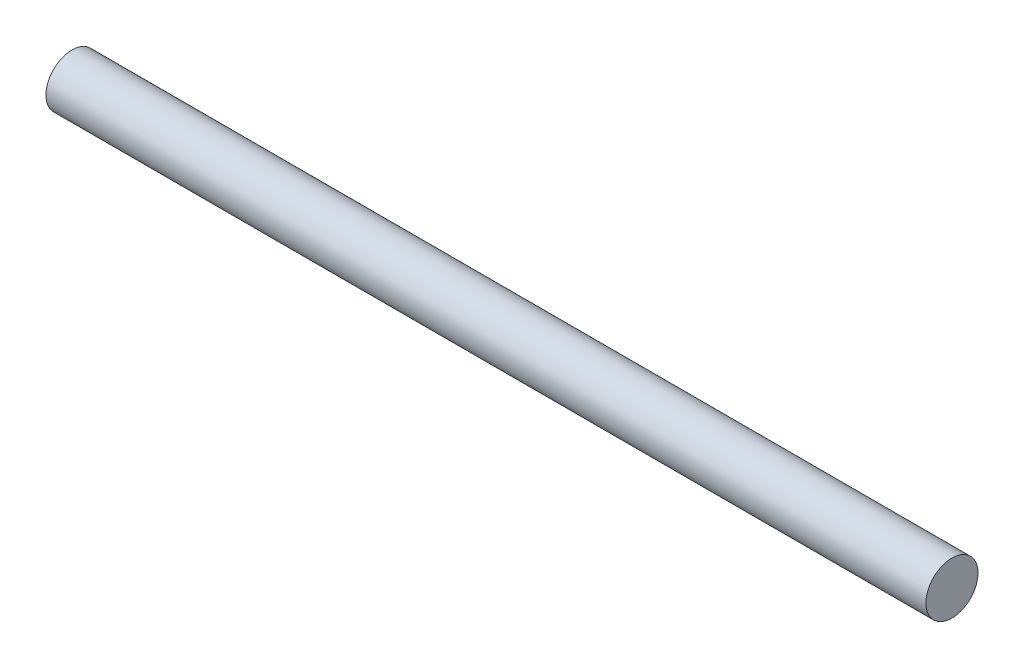
ISO-10303-21;
HEADER;
FILE_DESCRIPTION(('STEP AP214'),'2;1');
FILE_NAME('part.step','',(''),(''),'','','');
FILE_SCHEMA(('AUTOMOTIVE_DESIGN { 1 0 10303 214 1 1 1 1 }'));
ENDSEC;
DATA;
#1=APPLICATION_CONTEXT('core data for automotive mechanical design processes');
#2=APPLICATION_PROTOCOL_DEFINITION('international standard','automotive_design',2000,#1);
#3=PRODUCT_CONTEXT('',#1,'mechanical');
#4=PRODUCT('Part','Part','',(#3));
#5=PRODUCT_RELATED_PRODUCT_CATEGORY('part','',(#4));
#6=PRODUCT_DEFINITION_FORMATION('','',#4);
#7=PRODUCT_DEFINITION_CONTEXT('part definition',#1,'design');
#8=PRODUCT_DEFINITION('design','',#6,#7);
#9=PRODUCT_DEFINITION_SHAPE('','',#8);
#10=(LENGTH_UNIT() NAMED_UNIT(*) SI_UNIT(.MILLI.,.METRE.));
#11=(NAMED_UNIT(*) PLANE_ANGLE_UNIT() SI_UNIT($,.RADIAN.));
#12=(NAMED_UNIT(*) SI_UNIT($,.STERADIAN.) SOLID_ANGLE_UNIT());
#13=UNCERTAINTY_MEASURE_WITH_UNIT(LENGTH_MEASURE(1.E-05),#10,'distance_accuracy_value','');
#14=(GEOMETRIC_REPRESENTATION_CONTEXT(3) GLOBAL_UNCERTAINTY_ASSIGNED_CONTEXT((#13)) GLOBAL_UNIT_ASSIGNED_CONTEXT((#10,
#11,#12)) REPRESENTATION_CONTEXT('',''));
#15=CARTESIAN_POINT('',(0.,0.,0.));
#16=DIRECTION('',(0.,0.,1.));
#17=DIRECTION('',(1.,0.,0.));
#18=AXIS2_PLACEMENT_3D('',#15,#16,#17);
#19=CARTESIAN_POINT('',(76.,0.,0.));
#20=DIRECTION('',(-1.,0.,0.));
#21=DIRECTION('',(0.,0.,1.));
#22=AXIS2_PLACEMENT_3D('',#19,#20,#21);
#23=CYLINDRICAL_SURFACE('',#22,2.25);
#24=CARTESIAN_POINT('',(76.,0.,0.));
#25=DIRECTION('',(1.,0.,0.));
#26=DIRECTION('',(0.,0.,-1.));
#27=AXIS2_PLACEMENT_3D('',#24,#25,#26);
#28=CIRCLE('',#27,2.25);
#29=CARTESIAN_POINT('',(76.,0.,-2.25));
#30=VERTEX_POINT('',#29);
#31=EDGE_CURVE('E10',#30,#30,#28,.T.);
#32=ORIENTED_EDGE('',*,*,#31,.F.);
#33=EDGE_LOOP('',(#32));
#34=FACE_BOUND('',#33,.T.);
#35=CARTESIAN_POINT('',(0.,0.,0.));
#36=DIRECTION('',(1.,0.,0.));
#37=DIRECTION('',(0.,0.,-1.));
#38=AXIS2_PLACEMENT_3D('',#35,#36,#37);
#39=CIRCLE('',#38,2.25);
#40=CARTESIAN_POINT('',(0.,0.,-2.25));
#41=VERTEX_POINT('',#40);
#42=EDGE_CURVE('E34',#41,#41,#39,.T.);
#43=ORIENTED_EDGE('',*,*,#42,.T.);
#44=EDGE_LOOP('',(#43));
#45=FACE_BOUND('',#44,.T.);
#46=ADVANCED_FACE('F31',(#34,#45),#23,.T.);
#47=CARTESIAN_POINT('',(76.,0.,0.));
#48=DIRECTION('',(1.,0.,0.));
#49=DIRECTION('',(0.,0.,-1.));
#50=AXIS2_PLACEMENT_3D('',#47,#48,#49);
#51=PLANE('',#50);
#52=ORIENTED_EDGE('',*,*,#31,.T.);
#53=EDGE_LOOP('',(#52));
#54=FACE_BOUND('',#53,.T.);
#55=ADVANCED_FACE('F46',(#54),#51,.T.);
#56=CARTESIAN_POINT('',(0.,0.,0.));
#57=DIRECTION('',(1.,0.,0.));
#58=DIRECTION('',(0.,0.,-1.));
#59=AXIS2_PLACEMENT_3D('',#56,#57,#58);
#60=PLANE('',#59);
#61=ORIENTED_EDGE('',*,*,#42,.F.);
#62=EDGE_LOOP('',(#61));
#63=FACE_BOUND('',#62,.T.);
#64=ADVANCED_FACE('F44',(#63),#60,.F.);
#65=CLOSED_SHELL('',(#46,#55,#64));
#66=MANIFOLD_SOLID_BREP('B2',#65);
#67=ADVANCED_BREP_SHAPE_REPRESENTATION('',(#18,#66),#14);
#68=SHAPE_DEFINITION_REPRESENTATION(#9,#67);
ENDSEC;
END-ISO-10303-21;
